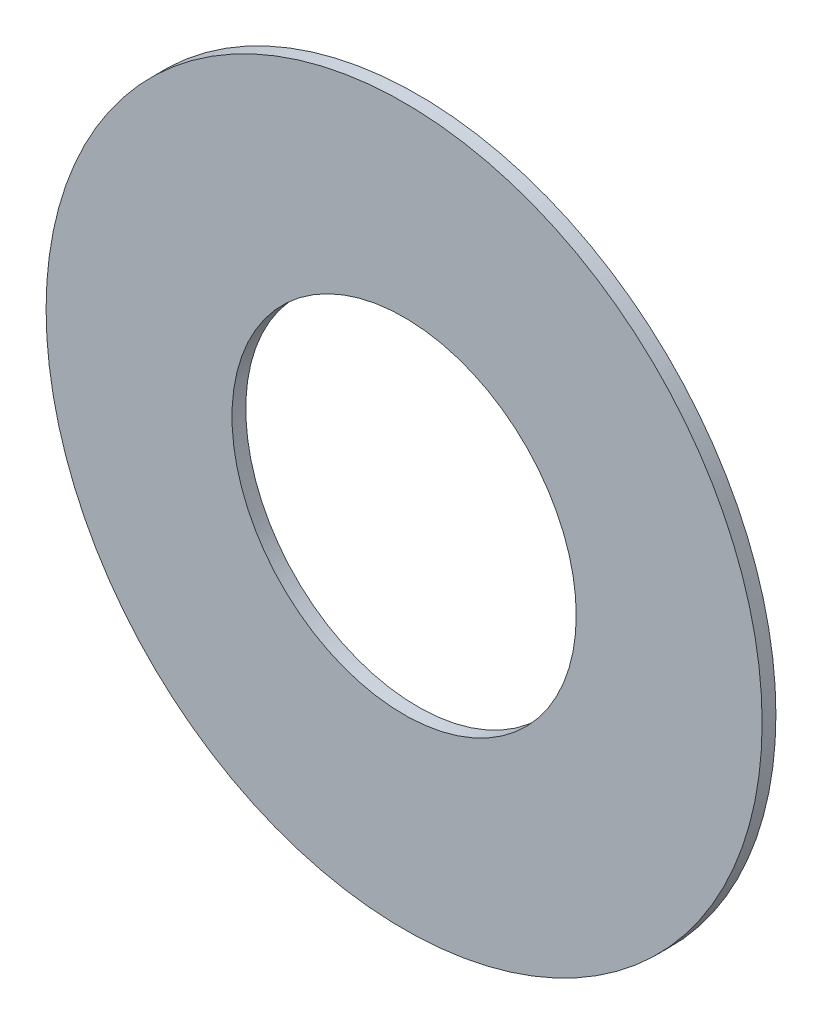
ISO-10303-21;
HEADER;
FILE_DESCRIPTION(('STEP AP214'),'2;1');
FILE_NAME('part.step','',(''),(''),'','','');
FILE_SCHEMA(('AUTOMOTIVE_DESIGN { 1 0 10303 214 1 1 1 1 }'));
ENDSEC;
DATA;
#1=APPLICATION_CONTEXT('core data for automotive mechanical design processes');
#2=APPLICATION_PROTOCOL_DEFINITION('international standard','automotive_design',2000,#1);
#3=PRODUCT_CONTEXT('',#1,'mechanical');
#4=PRODUCT('Part','Part','',(#3));
#5=PRODUCT_RELATED_PRODUCT_CATEGORY('part','',(#4));
#6=PRODUCT_DEFINITION_FORMATION('','',#4);
#7=PRODUCT_DEFINITION_CONTEXT('part definition',#1,'design');
#8=PRODUCT_DEFINITION('design','',#6,#7);
#9=PRODUCT_DEFINITION_SHAPE('','',#8);
#10=(LENGTH_UNIT() NAMED_UNIT(*) SI_UNIT(.MILLI.,.METRE.));
#11=(NAMED_UNIT(*) PLANE_ANGLE_UNIT() SI_UNIT($,.RADIAN.));
#12=(NAMED_UNIT(*) SI_UNIT($,.STERADIAN.) SOLID_ANGLE_UNIT());
#13=UNCERTAINTY_MEASURE_WITH_UNIT(LENGTH_MEASURE(1.E-05),#10,'distance_accuracy_value','');
#14=(GEOMETRIC_REPRESENTATION_CONTEXT(3) GLOBAL_UNCERTAINTY_ASSIGNED_CONTEXT((#13)) GLOBAL_UNIT_ASSIGNED_CONTEXT((#10,
#11,#12)) REPRESENTATION_CONTEXT('',''));
#15=CARTESIAN_POINT('',(0.,0.,0.));
#16=DIRECTION('',(0.,0.,1.));
#17=DIRECTION('',(1.,0.,0.));
#18=AXIS2_PLACEMENT_3D('',#15,#16,#17);
#19=CARTESIAN_POINT('',(0.,0.,1.));
#20=DIRECTION('',(0.,0.,1.));
#21=DIRECTION('',(1.,0.,0.));
#22=AXIS2_PLACEMENT_3D('',#19,#20,#21);
#23=PLANE('',#22);
#24=CARTESIAN_POINT('',(0.,0.,1.));
#25=DIRECTION('',(0.,0.,1.));
#26=DIRECTION('',(1.,0.,0.));
#27=AXIS2_PLACEMENT_3D('',#24,#25,#26);
#28=CIRCLE('',#27,26.);
#29=CARTESIAN_POINT('',(26.,0.,1.));
#30=VERTEX_POINT('',#29);
#31=EDGE_CURVE('E10',#30,#30,#28,.T.);
#32=ORIENTED_EDGE('',*,*,#31,.T.);
#33=EDGE_LOOP('',(#32));
#34=FACE_BOUND('',#33,.T.);
#35=CARTESIAN_POINT('',(0.,0.,1.));
#36=DIRECTION('',(0.,0.,1.));
#37=DIRECTION('',(1.,0.,0.));
#38=AXIS2_PLACEMENT_3D('',#35,#36,#37);
#39=CIRCLE('',#38,12.5);
#40=CARTESIAN_POINT('',(12.5,0.,1.));
#41=VERTEX_POINT('',#40);
#42=EDGE_CURVE('E42',#41,#41,#39,.T.);
#43=ORIENTED_EDGE('',*,*,#42,.F.);
#44=EDGE_LOOP('',(#43));
#45=FACE_BOUND('',#44,.T.);
#46=ADVANCED_FACE('F31',(#34,#45),#23,.T.);
#47=CARTESIAN_POINT('',(0.,0.,0.));
#48=DIRECTION('',(0.,0.,1.));
#49=DIRECTION('',(1.,0.,0.));
#50=AXIS2_PLACEMENT_3D('',#47,#48,#49);
#51=PLANE('',#50);
#52=CARTESIAN_POINT('',(0.,0.,0.));
#53=DIRECTION('',(0.,0.,1.));
#54=DIRECTION('',(1.,0.,0.));
#55=AXIS2_PLACEMENT_3D('',#52,#53,#54);
#56=CIRCLE('',#55,26.);
#57=CARTESIAN_POINT('',(26.,0.,0.));
#58=VERTEX_POINT('',#57);
#59=EDGE_CURVE('E35',#58,#58,#56,.T.);
#60=ORIENTED_EDGE('',*,*,#59,.F.);
#61=EDGE_LOOP('',(#60));
#62=FACE_BOUND('',#61,.T.);
#63=CARTESIAN_POINT('',(0.,0.,0.));
#64=DIRECTION('',(0.,0.,1.));
#65=DIRECTION('',(1.,0.,0.));
#66=AXIS2_PLACEMENT_3D('',#63,#64,#65);
#67=CIRCLE('',#66,12.5);
#68=CARTESIAN_POINT('',(12.5,0.,0.));
#69=VERTEX_POINT('',#68);
#70=EDGE_CURVE('E44',#69,#69,#67,.T.);
#71=ORIENTED_EDGE('',*,*,#70,.T.);
#72=EDGE_LOOP('',(#71));
#73=FACE_BOUND('',#72,.T.);
#74=ADVANCED_FACE('F54',(#62,#73),#51,.F.);
#75=CARTESIAN_POINT('',(0.,0.,1.));
#76=DIRECTION('',(0.,0.,-1.));
#77=DIRECTION('',(-1.,0.,0.));
#78=AXIS2_PLACEMENT_3D('',#75,#76,#77);
#79=CYLINDRICAL_SURFACE('',#78,26.);
#80=ORIENTED_EDGE('',*,*,#31,.F.);
#81=EDGE_LOOP('',(#80));
#82=FACE_BOUND('',#81,.T.);
#83=ORIENTED_EDGE('',*,*,#59,.T.);
#84=EDGE_LOOP('',(#83));
#85=FACE_BOUND('',#84,.T.);
#86=ADVANCED_FACE('F33',(#82,#85),#79,.T.);
#87=CARTESIAN_POINT('',(0.,0.,1.));
#88=DIRECTION('',(0.,0.,-1.));
#89=DIRECTION('',(-1.,0.,0.));
#90=AXIS2_PLACEMENT_3D('',#87,#88,#89);
#91=CYLINDRICAL_SURFACE('',#90,12.5);
#92=ORIENTED_EDGE('',*,*,#42,.T.);
#93=EDGE_LOOP('',(#92));
#94=FACE_BOUND('',#93,.T.);
#95=ORIENTED_EDGE('',*,*,#70,.F.);
#96=EDGE_LOOP('',(#95));
#97=FACE_BOUND('',#96,.T.);
#98=ADVANCED_FACE('F50',(#94,#97),#91,.F.);
#99=CLOSED_SHELL('',(#46,#74,#86,#98));
#100=MANIFOLD_SOLID_BREP('B2',#99);
#101=ADVANCED_BREP_SHAPE_REPRESENTATION('',(#18,#100),#14);
#102=SHAPE_DEFINITION_REPRESENTATION(#9,#101);
ENDSEC;
END-ISO-10303-21;
